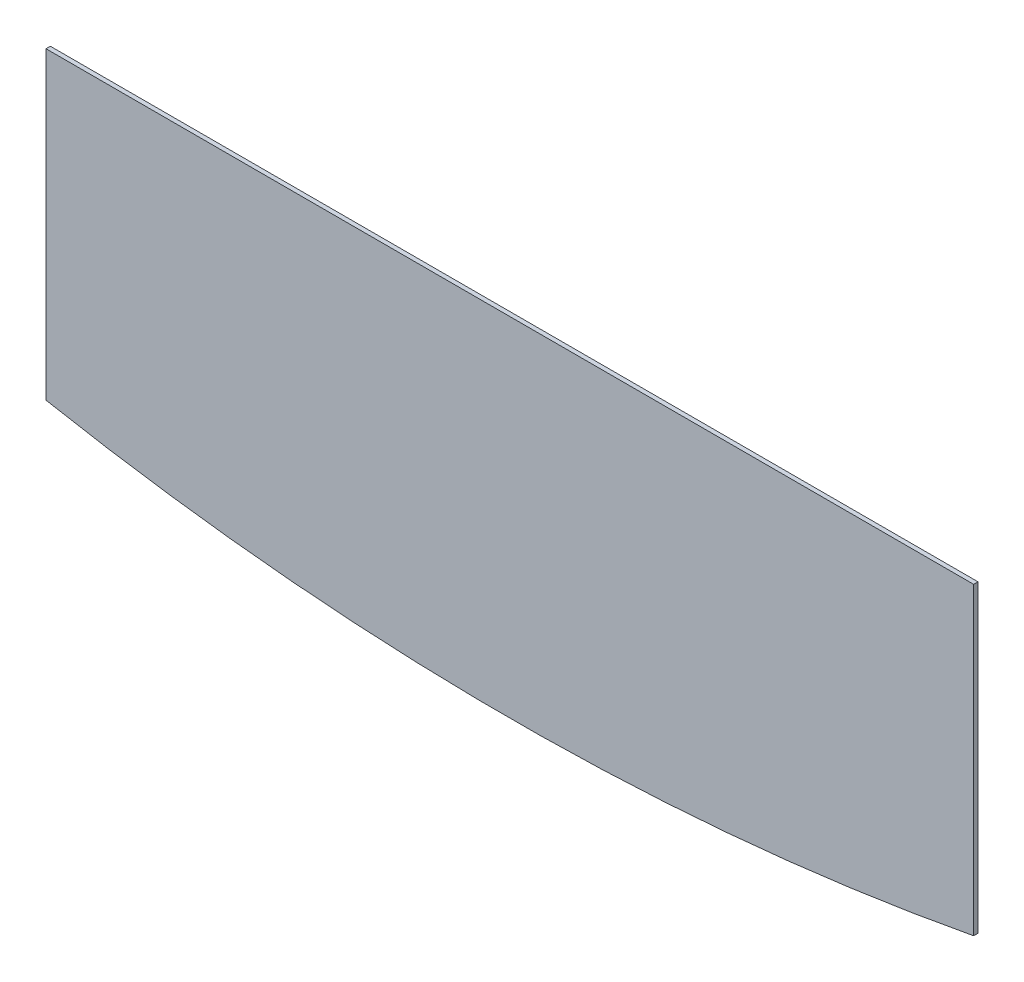
ISO-10303-21;
HEADER;
FILE_DESCRIPTION(('STEP AP214'),'2;1');
FILE_NAME('part.step','',(''),(''),'','','');
FILE_SCHEMA(('AUTOMOTIVE_DESIGN { 1 0 10303 214 1 1 1 1 }'));
ENDSEC;
DATA;
#1=APPLICATION_CONTEXT('core data for automotive mechanical design processes');
#2=APPLICATION_PROTOCOL_DEFINITION('international standard','automotive_design',2000,#1);
#3=PRODUCT_CONTEXT('',#1,'mechanical');
#4=PRODUCT('Part','Part','',(#3));
#5=PRODUCT_RELATED_PRODUCT_CATEGORY('part','',(#4));
#6=PRODUCT_DEFINITION_FORMATION('','',#4);
#7=PRODUCT_DEFINITION_CONTEXT('part definition',#1,'design');
#8=PRODUCT_DEFINITION('design','',#6,#7);
#9=PRODUCT_DEFINITION_SHAPE('','',#8);
#10=(LENGTH_UNIT() NAMED_UNIT(*) SI_UNIT(.MILLI.,.METRE.));
#11=(NAMED_UNIT(*) PLANE_ANGLE_UNIT() SI_UNIT($,.RADIAN.));
#12=(NAMED_UNIT(*) SI_UNIT($,.STERADIAN.) SOLID_ANGLE_UNIT());
#13=UNCERTAINTY_MEASURE_WITH_UNIT(LENGTH_MEASURE(1.E-05),#10,'distance_accuracy_value','');
#14=(GEOMETRIC_REPRESENTATION_CONTEXT(3) GLOBAL_UNCERTAINTY_ASSIGNED_CONTEXT((#13)) GLOBAL_UNIT_ASSIGNED_CONTEXT((#10,
#11,#12)) REPRESENTATION_CONTEXT('',''));
#15=CARTESIAN_POINT('',(0.,0.,0.));
#16=DIRECTION('',(0.,0.,1.));
#17=DIRECTION('',(1.,0.,0.));
#18=AXIS2_PLACEMENT_3D('',#15,#16,#17);
#19=CARTESIAN_POINT('',(160.,860.833333333332,430.579301973892));
#20=DIRECTION('',(0.,0.,-1.));
#21=DIRECTION('',(-1.,0.,0.));
#22=AXIS2_PLACEMENT_3D('',#19,#20,#21);
#23=CYLINDRICAL_SURFACE('',#22,860.833333333332);
#24=CARTESIAN_POINT('',(160.,860.833333333332,1.5));
#25=DIRECTION('',(0.,0.,-1.));
#26=DIRECTION('',(-1.,0.,0.));
#27=AXIS2_PLACEMENT_3D('',#24,#25,#26);
#28=CIRCLE('',#27,860.833333333332);
#29=CARTESIAN_POINT('',(320.,15.,1.5));
#30=VERTEX_POINT('',#29);
#31=CARTESIAN_POINT('',(-4.71844785465692E-13,15.0000000000001,1.5));
#32=VERTEX_POINT('',#31);
#33=EDGE_CURVE('E94',#30,#32,#28,.T.);
#34=ORIENTED_EDGE('',*,*,#33,.T.);
#35=DIRECTION('',(0.,0.,-1.));
#36=VECTOR('',#35,1.);
#37=CARTESIAN_POINT('',(-4.71844785465692E-13,15.0000000000001,430.579301973892));
#38=LINE('',#37,#36);
#39=CARTESIAN_POINT('',(0.,15.0000000000001,0.));
#40=VERTEX_POINT('',#39);
#41=EDGE_CURVE('E82',#32,#40,#38,.T.);
#42=ORIENTED_EDGE('',*,*,#41,.T.);
#43=CARTESIAN_POINT('',(160.,860.833333333332,0.));
#44=DIRECTION('',(0.,0.,-1.));
#45=DIRECTION('',(-1.,0.,0.));
#46=AXIS2_PLACEMENT_3D('',#43,#44,#45);
#47=CIRCLE('',#46,860.833333333332);
#48=CARTESIAN_POINT('',(320.,15.,0.));
#49=VERTEX_POINT('',#48);
#50=EDGE_CURVE('E48',#49,#40,#47,.T.);
#51=ORIENTED_EDGE('',*,*,#50,.F.);
#52=DIRECTION('',(0.,0.,-1.));
#53=VECTOR('',#52,1.);
#54=CARTESIAN_POINT('',(320.,15.,430.579301973892));
#55=LINE('',#54,#53);
#56=EDGE_CURVE('E85',#30,#49,#55,.T.);
#57=ORIENTED_EDGE('',*,*,#56,.F.);
#58=EDGE_LOOP('',(#34,#42,#51,#57));
#59=FACE_BOUND('',#58,.T.);
#60=ADVANCED_FACE('F33',(#59),#23,.T.);
#61=CARTESIAN_POINT('',(0.,0.,0.));
#62=DIRECTION('',(0.,0.,-1.));
#63=DIRECTION('',(-1.,0.,0.));
#64=AXIS2_PLACEMENT_3D('',#61,#62,#63);
#65=PLANE('',#64);
#66=DIRECTION('',(0.,1.,0.));
#67=VECTOR('',#66,1.);
#68=CARTESIAN_POINT('',(320.,0.,0.));
#69=LINE('',#68,#67);
#70=CARTESIAN_POINT('',(320.,120.,0.));
#71=VERTEX_POINT('',#70);
#72=EDGE_CURVE('E75',#49,#71,#69,.T.);
#73=ORIENTED_EDGE('',*,*,#72,.F.);
#74=ORIENTED_EDGE('',*,*,#50,.T.);
#75=DIRECTION('',(0.,-1.,0.));
#76=VECTOR('',#75,1.);
#77=CARTESIAN_POINT('',(0.,0.,0.));
#78=LINE('',#77,#76);
#79=CARTESIAN_POINT('',(0.,120.,0.));
#80=VERTEX_POINT('',#79);
#81=EDGE_CURVE('E80',#80,#40,#78,.T.);
#82=ORIENTED_EDGE('',*,*,#81,.F.);
#83=DIRECTION('',(-1.,0.,0.));
#84=VECTOR('',#83,1.);
#85=CARTESIAN_POINT('',(0.,120.,0.));
#86=LINE('',#85,#84);
#87=EDGE_CURVE('E69',#71,#80,#86,.T.);
#88=ORIENTED_EDGE('',*,*,#87,.F.);
#89=EDGE_LOOP('',(#73,#74,#82,#88));
#90=FACE_BOUND('',#89,.T.);
#91=ADVANCED_FACE('F81',(#90),#65,.T.);
#92=CARTESIAN_POINT('',(0.,0.,1.5));
#93=DIRECTION('',(1.,0.,0.));
#94=DIRECTION('',(0.,0.,-1.));
#95=AXIS2_PLACEMENT_3D('',#92,#93,#94);
#96=PLANE('',#95);
#97=ORIENTED_EDGE('',*,*,#81,.T.);
#98=ORIENTED_EDGE('',*,*,#41,.F.);
#99=DIRECTION('',(0.,-1.,0.));
#100=VECTOR('',#99,1.);
#101=CARTESIAN_POINT('',(0.,0.,1.5));
#102=LINE('',#101,#100);
#103=CARTESIAN_POINT('',(0.,120.,1.5));
#104=VERTEX_POINT('',#103);
#105=EDGE_CURVE('E74',#104,#32,#102,.T.);
#106=ORIENTED_EDGE('',*,*,#105,.F.);
#107=DIRECTION('',(0.,0.,-1.));
#108=VECTOR('',#107,1.);
#109=CARTESIAN_POINT('',(0.,120.,1.5));
#110=LINE('',#109,#108);
#111=EDGE_CURVE('E41',#104,#80,#110,.T.);
#112=ORIENTED_EDGE('',*,*,#111,.T.);
#113=EDGE_LOOP('',(#97,#98,#106,#112));
#114=FACE_BOUND('',#113,.T.);
#115=ADVANCED_FACE('F35',(#114),#96,.F.);
#116=CARTESIAN_POINT('',(320.,0.,1.5));
#117=DIRECTION('',(-1.,0.,0.));
#118=DIRECTION('',(0.,0.,1.));
#119=AXIS2_PLACEMENT_3D('',#116,#117,#118);
#120=PLANE('',#119);
#121=DIRECTION('',(0.,1.,0.));
#122=VECTOR('',#121,1.);
#123=CARTESIAN_POINT('',(320.,0.,1.5));
#124=LINE('',#123,#122);
#125=CARTESIAN_POINT('',(320.,120.,1.5));
#126=VERTEX_POINT('',#125);
#127=EDGE_CURVE('E89',#30,#126,#124,.T.);
#128=ORIENTED_EDGE('',*,*,#127,.F.);
#129=ORIENTED_EDGE('',*,*,#56,.T.);
#130=ORIENTED_EDGE('',*,*,#72,.T.);
#131=DIRECTION('',(0.,0.,-1.));
#132=VECTOR('',#131,1.);
#133=CARTESIAN_POINT('',(320.,120.,1.5));
#134=LINE('',#133,#132);
#135=EDGE_CURVE('E11',#126,#71,#134,.T.);
#136=ORIENTED_EDGE('',*,*,#135,.F.);
#137=EDGE_LOOP('',(#128,#129,#130,#136));
#138=FACE_BOUND('',#137,.T.);
#139=ADVANCED_FACE('F110',(#138),#120,.F.);
#140=CARTESIAN_POINT('',(0.,120.,1.5));
#141=DIRECTION('',(0.,-1.,0.));
#142=DIRECTION('',(0.,0.,-1.));
#143=AXIS2_PLACEMENT_3D('',#140,#141,#142);
#144=PLANE('',#143);
#145=ORIENTED_EDGE('',*,*,#87,.T.);
#146=ORIENTED_EDGE('',*,*,#111,.F.);
#147=DIRECTION('',(-1.,0.,0.));
#148=VECTOR('',#147,1.);
#149=CARTESIAN_POINT('',(0.,120.,1.5));
#150=LINE('',#149,#148);
#151=EDGE_CURVE('E57',#126,#104,#150,.T.);
#152=ORIENTED_EDGE('',*,*,#151,.F.);
#153=ORIENTED_EDGE('',*,*,#135,.T.);
#154=EDGE_LOOP('',(#145,#146,#152,#153));
#155=FACE_BOUND('',#154,.T.);
#156=ADVANCED_FACE('F71',(#155),#144,.F.);
#157=CARTESIAN_POINT('',(0.,0.,1.5));
#158=DIRECTION('',(0.,0.,-1.));
#159=DIRECTION('',(-1.,0.,0.));
#160=AXIS2_PLACEMENT_3D('',#157,#158,#159);
#161=PLANE('',#160);
#162=ORIENTED_EDGE('',*,*,#105,.T.);
#163=ORIENTED_EDGE('',*,*,#33,.F.);
#164=ORIENTED_EDGE('',*,*,#127,.T.);
#165=ORIENTED_EDGE('',*,*,#151,.T.);
#166=EDGE_LOOP('',(#162,#163,#164,#165));
#167=FACE_BOUND('',#166,.T.);
#168=ADVANCED_FACE('F104',(#167),#161,.F.);
#169=CLOSED_SHELL('',(#60,#91,#115,#139,#156,#168));
#170=MANIFOLD_SOLID_BREP('B2',#169);
#171=ADVANCED_BREP_SHAPE_REPRESENTATION('',(#18,#170),#14);
#172=SHAPE_DEFINITION_REPRESENTATION(#9,#171);
ENDSEC;
END-ISO-10303-21;
